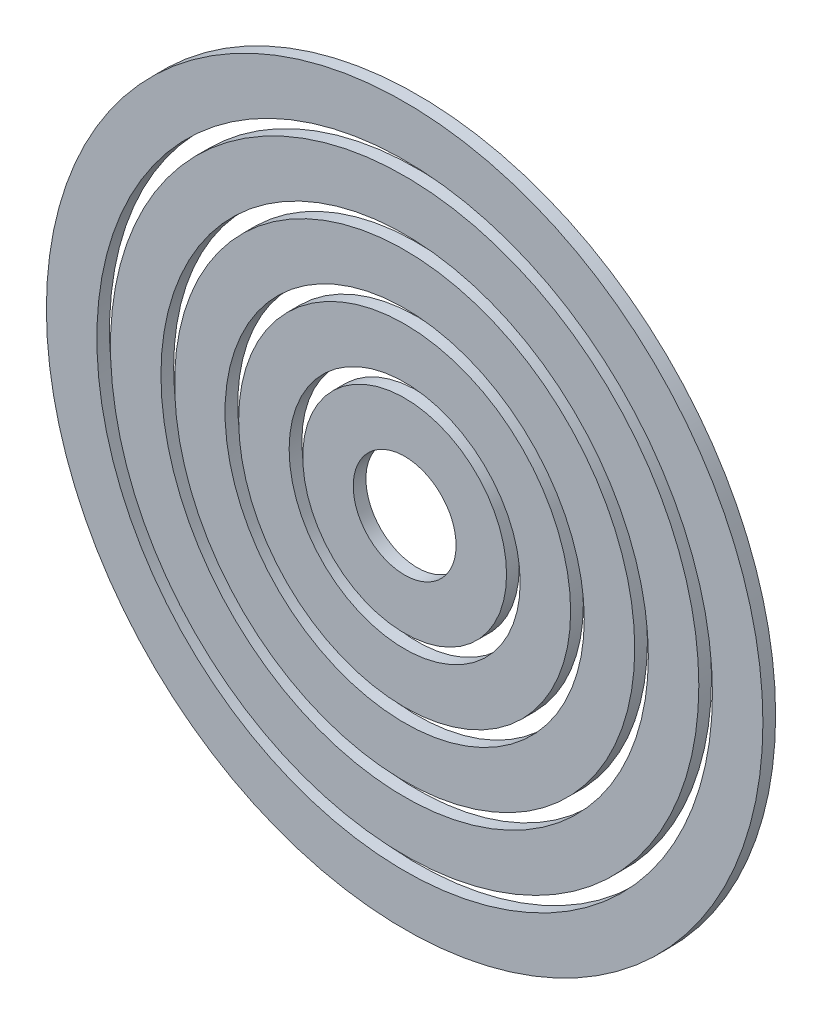
ISO-10303-21;
HEADER;
FILE_DESCRIPTION(('STEP AP214'),'2;1');
FILE_NAME('part.step','',(''),(''),'','','');
FILE_SCHEMA(('AUTOMOTIVE_DESIGN { 1 0 10303 214 1 1 1 1 }'));
ENDSEC;
DATA;
#1=APPLICATION_CONTEXT('core data for automotive mechanical design processes');
#2=APPLICATION_PROTOCOL_DEFINITION('international standard','automotive_design',2000,#1);
#3=PRODUCT_CONTEXT('',#1,'mechanical');
#4=PRODUCT('Part','Part','',(#3));
#5=PRODUCT_RELATED_PRODUCT_CATEGORY('part','',(#4));
#6=PRODUCT_DEFINITION_FORMATION('','',#4);
#7=PRODUCT_DEFINITION_CONTEXT('part definition',#1,'design');
#8=PRODUCT_DEFINITION('design','',#6,#7);
#9=PRODUCT_DEFINITION_SHAPE('','',#8);
#10=(LENGTH_UNIT() NAMED_UNIT(*) SI_UNIT(.MILLI.,.METRE.));
#11=(NAMED_UNIT(*) PLANE_ANGLE_UNIT() SI_UNIT($,.RADIAN.));
#12=(NAMED_UNIT(*) SI_UNIT($,.STERADIAN.) SOLID_ANGLE_UNIT());
#13=UNCERTAINTY_MEASURE_WITH_UNIT(LENGTH_MEASURE(1.E-05),#10,'distance_accuracy_value','');
#14=(GEOMETRIC_REPRESENTATION_CONTEXT(3) GLOBAL_UNCERTAINTY_ASSIGNED_CONTEXT((#13)) GLOBAL_UNIT_ASSIGNED_CONTEXT((#10,
#11,#12)) REPRESENTATION_CONTEXT('',''));
#15=CARTESIAN_POINT('',(0.,0.,0.));
#16=DIRECTION('',(0.,0.,1.));
#17=DIRECTION('',(1.,0.,0.));
#18=AXIS2_PLACEMENT_3D('',#15,#16,#17);
#19=CARTESIAN_POINT('',(0.,0.,1.9812));
#20=DIRECTION('',(0.,0.,-1.));
#21=DIRECTION('',(-1.,0.,0.));
#22=AXIS2_PLACEMENT_3D('',#19,#20,#21);
#23=CYLINDRICAL_SURFACE('',#22,8.026);
#24=CARTESIAN_POINT('',(0.,0.,1.9812));
#25=DIRECTION('',(0.,0.,1.));
#26=DIRECTION('',(1.,0.,0.));
#27=AXIS2_PLACEMENT_3D('',#24,#25,#26);
#28=CIRCLE('',#27,8.026);
#29=CARTESIAN_POINT('',(8.026,0.,1.9812));
#30=VERTEX_POINT('',#29);
#31=EDGE_CURVE('E110',#30,#30,#28,.T.);
#32=ORIENTED_EDGE('',*,*,#31,.T.);
#33=EDGE_LOOP('',(#32));
#34=FACE_BOUND('',#33,.T.);
#35=CARTESIAN_POINT('',(0.,0.,0.));
#36=DIRECTION('',(0.,0.,1.));
#37=DIRECTION('',(1.,0.,0.));
#38=AXIS2_PLACEMENT_3D('',#35,#36,#37);
#39=CIRCLE('',#38,8.026);
#40=CARTESIAN_POINT('',(8.026,0.,0.));
#41=VERTEX_POINT('',#40);
#42=EDGE_CURVE('E116',#41,#41,#39,.T.);
#43=ORIENTED_EDGE('',*,*,#42,.F.);
#44=EDGE_LOOP('',(#43));
#45=FACE_BOUND('',#44,.T.);
#46=ADVANCED_FACE('F103',(#34,#45),#23,.F.);
#47=CARTESIAN_POINT('',(0.,0.,1.9812));
#48=DIRECTION('',(0.,0.,-1.));
#49=DIRECTION('',(-1.,0.,0.));
#50=AXIS2_PLACEMENT_3D('',#47,#48,#49);
#51=CYLINDRICAL_SURFACE('',#50,15.9);
#52=CARTESIAN_POINT('',(0.,0.,1.9812));
#53=DIRECTION('',(0.,0.,1.));
#54=DIRECTION('',(1.,0.,0.));
#55=AXIS2_PLACEMENT_3D('',#52,#53,#54);
#56=CIRCLE('',#55,15.9);
#57=CARTESIAN_POINT('',(15.9,0.,1.9812));
#58=VERTEX_POINT('',#57);
#59=EDGE_CURVE('E12',#58,#58,#56,.T.);
#60=ORIENTED_EDGE('',*,*,#59,.F.);
#61=EDGE_LOOP('',(#60));
#62=FACE_BOUND('',#61,.T.);
#63=CARTESIAN_POINT('',(0.,0.,0.));
#64=DIRECTION('',(0.,0.,1.));
#65=DIRECTION('',(1.,0.,0.));
#66=AXIS2_PLACEMENT_3D('',#63,#64,#65);
#67=CIRCLE('',#66,15.9);
#68=CARTESIAN_POINT('',(15.9,0.,0.));
#69=VERTEX_POINT('',#68);
#70=EDGE_CURVE('E106',#69,#69,#67,.T.);
#71=ORIENTED_EDGE('',*,*,#70,.T.);
#72=EDGE_LOOP('',(#71));
#73=FACE_BOUND('',#72,.T.);
#74=ADVANCED_FACE('F123',(#62,#73),#51,.T.);
#75=CARTESIAN_POINT('',(0.,0.,1.9812));
#76=DIRECTION('',(0.,0.,1.));
#77=DIRECTION('',(1.,0.,0.));
#78=AXIS2_PLACEMENT_3D('',#75,#76,#77);
#79=PLANE('',#78);
#80=ORIENTED_EDGE('',*,*,#31,.F.);
#81=EDGE_LOOP('',(#80));
#82=FACE_BOUND('',#81,.T.);
#83=ORIENTED_EDGE('',*,*,#59,.T.);
#84=EDGE_LOOP('',(#83));
#85=FACE_BOUND('',#84,.T.);
#86=ADVANCED_FACE('F127',(#82,#85),#79,.T.);
#87=CARTESIAN_POINT('',(0.,0.,0.));
#88=DIRECTION('',(0.,0.,1.));
#89=DIRECTION('',(1.,0.,0.));
#90=AXIS2_PLACEMENT_3D('',#87,#88,#89);
#91=PLANE('',#90);
#92=ORIENTED_EDGE('',*,*,#42,.T.);
#93=EDGE_LOOP('',(#92));
#94=FACE_BOUND('',#93,.T.);
#95=ORIENTED_EDGE('',*,*,#70,.F.);
#96=EDGE_LOOP('',(#95));
#97=FACE_BOUND('',#96,.T.);
#98=ADVANCED_FACE('F125',(#94,#97),#91,.F.);
#99=CLOSED_SHELL('',(#46,#74,#86,#98));
#100=MANIFOLD_SOLID_BREP('B2',#99);
#101=CARTESIAN_POINT('',(0.,0.,1.9812));
#102=DIRECTION('',(0.,0.,-1.));
#103=DIRECTION('',(-1.,0.,0.));
#104=AXIS2_PLACEMENT_3D('',#101,#102,#103);
#105=CYLINDRICAL_SURFACE('',#104,18.026);
#106=CARTESIAN_POINT('',(0.,0.,1.9812));
#107=DIRECTION('',(0.,0.,1.));
#108=DIRECTION('',(1.,0.,0.));
#109=AXIS2_PLACEMENT_3D('',#106,#107,#108);
#110=CIRCLE('',#109,18.026);
#111=CARTESIAN_POINT('',(18.026,0.,1.9812));
#112=VERTEX_POINT('',#111);
#113=EDGE_CURVE('E179',#112,#112,#110,.T.);
#114=ORIENTED_EDGE('',*,*,#113,.T.);
#115=EDGE_LOOP('',(#114));
#116=FACE_BOUND('',#115,.T.);
#117=CARTESIAN_POINT('',(0.,0.,0.));
#118=DIRECTION('',(0.,0.,1.));
#119=DIRECTION('',(1.,0.,0.));
#120=AXIS2_PLACEMENT_3D('',#117,#118,#119);
#121=CIRCLE('',#120,18.026);
#122=CARTESIAN_POINT('',(18.026,0.,0.));
#123=VERTEX_POINT('',#122);
#124=EDGE_CURVE('E185',#123,#123,#121,.T.);
#125=ORIENTED_EDGE('',*,*,#124,.F.);
#126=EDGE_LOOP('',(#125));
#127=FACE_BOUND('',#126,.T.);
#128=ADVANCED_FACE('F172',(#116,#127),#105,.F.);
#129=CARTESIAN_POINT('',(0.,0.,1.9812));
#130=DIRECTION('',(0.,0.,-1.));
#131=DIRECTION('',(-1.,0.,0.));
#132=AXIS2_PLACEMENT_3D('',#129,#130,#131);
#133=CYLINDRICAL_SURFACE('',#132,25.9);
#134=CARTESIAN_POINT('',(0.,0.,1.9812));
#135=DIRECTION('',(0.,0.,1.));
#136=DIRECTION('',(1.,0.,0.));
#137=AXIS2_PLACEMENT_3D('',#134,#135,#136);
#138=CIRCLE('',#137,25.9);
#139=CARTESIAN_POINT('',(25.9,0.,1.9812));
#140=VERTEX_POINT('',#139);
#141=EDGE_CURVE('E102',#140,#140,#138,.T.);
#142=ORIENTED_EDGE('',*,*,#141,.F.);
#143=EDGE_LOOP('',(#142));
#144=FACE_BOUND('',#143,.T.);
#145=CARTESIAN_POINT('',(0.,0.,0.));
#146=DIRECTION('',(0.,0.,1.));
#147=DIRECTION('',(1.,0.,0.));
#148=AXIS2_PLACEMENT_3D('',#145,#146,#147);
#149=CIRCLE('',#148,25.9);
#150=CARTESIAN_POINT('',(25.9,0.,0.));
#151=VERTEX_POINT('',#150);
#152=EDGE_CURVE('E175',#151,#151,#149,.T.);
#153=ORIENTED_EDGE('',*,*,#152,.T.);
#154=EDGE_LOOP('',(#153));
#155=FACE_BOUND('',#154,.T.);
#156=ADVANCED_FACE('F192',(#144,#155),#133,.T.);
#157=CARTESIAN_POINT('',(0.,0.,1.9812));
#158=DIRECTION('',(0.,0.,1.));
#159=DIRECTION('',(1.,0.,0.));
#160=AXIS2_PLACEMENT_3D('',#157,#158,#159);
#161=PLANE('',#160);
#162=ORIENTED_EDGE('',*,*,#113,.F.);
#163=EDGE_LOOP('',(#162));
#164=FACE_BOUND('',#163,.T.);
#165=ORIENTED_EDGE('',*,*,#141,.T.);
#166=EDGE_LOOP('',(#165));
#167=FACE_BOUND('',#166,.T.);
#168=ADVANCED_FACE('F196',(#164,#167),#161,.T.);
#169=CARTESIAN_POINT('',(0.,0.,0.));
#170=DIRECTION('',(0.,0.,1.));
#171=DIRECTION('',(1.,0.,0.));
#172=AXIS2_PLACEMENT_3D('',#169,#170,#171);
#173=PLANE('',#172);
#174=ORIENTED_EDGE('',*,*,#124,.T.);
#175=EDGE_LOOP('',(#174));
#176=FACE_BOUND('',#175,.T.);
#177=ORIENTED_EDGE('',*,*,#152,.F.);
#178=EDGE_LOOP('',(#177));
#179=FACE_BOUND('',#178,.T.);
#180=ADVANCED_FACE('F194',(#176,#179),#173,.F.);
#181=CLOSED_SHELL('',(#128,#156,#168,#180));
#182=MANIFOLD_SOLID_BREP('B7',#181);
#183=CARTESIAN_POINT('',(0.,0.,1.9812));
#184=DIRECTION('',(0.,0.,-1.));
#185=DIRECTION('',(-1.,0.,0.));
#186=AXIS2_PLACEMENT_3D('',#183,#184,#185);
#187=CYLINDRICAL_SURFACE('',#186,28.026);
#188=CARTESIAN_POINT('',(0.,0.,1.9812));
#189=DIRECTION('',(0.,0.,1.));
#190=DIRECTION('',(1.,0.,0.));
#191=AXIS2_PLACEMENT_3D('',#188,#189,#190);
#192=CIRCLE('',#191,28.026);
#193=CARTESIAN_POINT('',(28.026,0.,1.9812));
#194=VERTEX_POINT('',#193);
#195=EDGE_CURVE('E248',#194,#194,#192,.T.);
#196=ORIENTED_EDGE('',*,*,#195,.T.);
#197=EDGE_LOOP('',(#196));
#198=FACE_BOUND('',#197,.T.);
#199=CARTESIAN_POINT('',(0.,0.,0.));
#200=DIRECTION('',(0.,0.,1.));
#201=DIRECTION('',(1.,0.,0.));
#202=AXIS2_PLACEMENT_3D('',#199,#200,#201);
#203=CIRCLE('',#202,28.026);
#204=CARTESIAN_POINT('',(28.026,0.,0.));
#205=VERTEX_POINT('',#204);
#206=EDGE_CURVE('E254',#205,#205,#203,.T.);
#207=ORIENTED_EDGE('',*,*,#206,.F.);
#208=EDGE_LOOP('',(#207));
#209=FACE_BOUND('',#208,.T.);
#210=ADVANCED_FACE('F241',(#198,#209),#187,.F.);
#211=CARTESIAN_POINT('',(0.,0.,1.9812));
#212=DIRECTION('',(0.,0.,-1.));
#213=DIRECTION('',(-1.,0.,0.));
#214=AXIS2_PLACEMENT_3D('',#211,#212,#213);
#215=CYLINDRICAL_SURFACE('',#214,35.9);
#216=CARTESIAN_POINT('',(0.,0.,1.9812));
#217=DIRECTION('',(0.,0.,1.));
#218=DIRECTION('',(1.,0.,0.));
#219=AXIS2_PLACEMENT_3D('',#216,#217,#218);
#220=CIRCLE('',#219,35.9);
#221=CARTESIAN_POINT('',(35.9,0.,1.9812));
#222=VERTEX_POINT('',#221);
#223=EDGE_CURVE('E171',#222,#222,#220,.T.);
#224=ORIENTED_EDGE('',*,*,#223,.F.);
#225=EDGE_LOOP('',(#224));
#226=FACE_BOUND('',#225,.T.);
#227=CARTESIAN_POINT('',(0.,0.,0.));
#228=DIRECTION('',(0.,0.,1.));
#229=DIRECTION('',(1.,0.,0.));
#230=AXIS2_PLACEMENT_3D('',#227,#228,#229);
#231=CIRCLE('',#230,35.9);
#232=CARTESIAN_POINT('',(35.9,0.,0.));
#233=VERTEX_POINT('',#232);
#234=EDGE_CURVE('E244',#233,#233,#231,.T.);
#235=ORIENTED_EDGE('',*,*,#234,.T.);
#236=EDGE_LOOP('',(#235));
#237=FACE_BOUND('',#236,.T.);
#238=ADVANCED_FACE('F261',(#226,#237),#215,.T.);
#239=CARTESIAN_POINT('',(0.,0.,1.9812));
#240=DIRECTION('',(0.,0.,1.));
#241=DIRECTION('',(1.,0.,0.));
#242=AXIS2_PLACEMENT_3D('',#239,#240,#241);
#243=PLANE('',#242);
#244=ORIENTED_EDGE('',*,*,#195,.F.);
#245=EDGE_LOOP('',(#244));
#246=FACE_BOUND('',#245,.T.);
#247=ORIENTED_EDGE('',*,*,#223,.T.);
#248=EDGE_LOOP('',(#247));
#249=FACE_BOUND('',#248,.T.);
#250=ADVANCED_FACE('F265',(#246,#249),#243,.T.);
#251=CARTESIAN_POINT('',(0.,0.,0.));
#252=DIRECTION('',(0.,0.,1.));
#253=DIRECTION('',(1.,0.,0.));
#254=AXIS2_PLACEMENT_3D('',#251,#252,#253);
#255=PLANE('',#254);
#256=ORIENTED_EDGE('',*,*,#206,.T.);
#257=EDGE_LOOP('',(#256));
#258=FACE_BOUND('',#257,.T.);
#259=ORIENTED_EDGE('',*,*,#234,.F.);
#260=EDGE_LOOP('',(#259));
#261=FACE_BOUND('',#260,.T.);
#262=ADVANCED_FACE('F263',(#258,#261),#255,.F.);
#263=CLOSED_SHELL('',(#210,#238,#250,#262));
#264=MANIFOLD_SOLID_BREP('B97',#263);
#265=CARTESIAN_POINT('',(0.,0.,1.9812));
#266=DIRECTION('',(0.,0.,-1.));
#267=DIRECTION('',(-1.,0.,0.));
#268=AXIS2_PLACEMENT_3D('',#265,#266,#267);
#269=CYLINDRICAL_SURFACE('',#268,38.026);
#270=CARTESIAN_POINT('',(0.,0.,1.9812));
#271=DIRECTION('',(0.,0.,1.));
#272=DIRECTION('',(1.,0.,0.));
#273=AXIS2_PLACEMENT_3D('',#270,#271,#272);
#274=CIRCLE('',#273,38.026);
#275=CARTESIAN_POINT('',(38.026,0.,1.9812));
#276=VERTEX_POINT('',#275);
#277=EDGE_CURVE('E316',#276,#276,#274,.T.);
#278=ORIENTED_EDGE('',*,*,#277,.T.);
#279=EDGE_LOOP('',(#278));
#280=FACE_BOUND('',#279,.T.);
#281=CARTESIAN_POINT('',(0.,0.,0.));
#282=DIRECTION('',(0.,0.,1.));
#283=DIRECTION('',(1.,0.,0.));
#284=AXIS2_PLACEMENT_3D('',#281,#282,#283);
#285=CIRCLE('',#284,38.026);
#286=CARTESIAN_POINT('',(38.026,0.,0.));
#287=VERTEX_POINT('',#286);
#288=EDGE_CURVE('E322',#287,#287,#285,.T.);
#289=ORIENTED_EDGE('',*,*,#288,.F.);
#290=EDGE_LOOP('',(#289));
#291=FACE_BOUND('',#290,.T.);
#292=ADVANCED_FACE('F309',(#280,#291),#269,.F.);
#293=CARTESIAN_POINT('',(0.,0.,1.9812));
#294=DIRECTION('',(0.,0.,-1.));
#295=DIRECTION('',(-1.,0.,0.));
#296=AXIS2_PLACEMENT_3D('',#293,#294,#295);
#297=CYLINDRICAL_SURFACE('',#296,45.9);
#298=CARTESIAN_POINT('',(0.,0.,1.9812));
#299=DIRECTION('',(0.,0.,1.));
#300=DIRECTION('',(1.,0.,0.));
#301=AXIS2_PLACEMENT_3D('',#298,#299,#300);
#302=CIRCLE('',#301,45.9);
#303=CARTESIAN_POINT('',(45.9,0.,1.9812));
#304=VERTEX_POINT('',#303);
#305=EDGE_CURVE('E240',#304,#304,#302,.T.);
#306=ORIENTED_EDGE('',*,*,#305,.F.);
#307=EDGE_LOOP('',(#306));
#308=FACE_BOUND('',#307,.T.);
#309=CARTESIAN_POINT('',(0.,0.,0.));
#310=DIRECTION('',(0.,0.,1.));
#311=DIRECTION('',(1.,0.,0.));
#312=AXIS2_PLACEMENT_3D('',#309,#310,#311);
#313=CIRCLE('',#312,45.9);
#314=CARTESIAN_POINT('',(45.9,0.,0.));
#315=VERTEX_POINT('',#314);
#316=EDGE_CURVE('E312',#315,#315,#313,.T.);
#317=ORIENTED_EDGE('',*,*,#316,.T.);
#318=EDGE_LOOP('',(#317));
#319=FACE_BOUND('',#318,.T.);
#320=ADVANCED_FACE('F329',(#308,#319),#297,.T.);
#321=CARTESIAN_POINT('',(0.,0.,1.9812));
#322=DIRECTION('',(0.,0.,1.));
#323=DIRECTION('',(1.,0.,0.));
#324=AXIS2_PLACEMENT_3D('',#321,#322,#323);
#325=PLANE('',#324);
#326=ORIENTED_EDGE('',*,*,#277,.F.);
#327=EDGE_LOOP('',(#326));
#328=FACE_BOUND('',#327,.T.);
#329=ORIENTED_EDGE('',*,*,#305,.T.);
#330=EDGE_LOOP('',(#329));
#331=FACE_BOUND('',#330,.T.);
#332=ADVANCED_FACE('F333',(#328,#331),#325,.T.);
#333=CARTESIAN_POINT('',(0.,0.,0.));
#334=DIRECTION('',(0.,0.,1.));
#335=DIRECTION('',(1.,0.,0.));
#336=AXIS2_PLACEMENT_3D('',#333,#334,#335);
#337=PLANE('',#336);
#338=ORIENTED_EDGE('',*,*,#288,.T.);
#339=EDGE_LOOP('',(#338));
#340=FACE_BOUND('',#339,.T.);
#341=ORIENTED_EDGE('',*,*,#316,.F.);
#342=EDGE_LOOP('',(#341));
#343=FACE_BOUND('',#342,.T.);
#344=ADVANCED_FACE('F331',(#340,#343),#337,.F.);
#345=CLOSED_SHELL('',(#292,#320,#332,#344));
#346=MANIFOLD_SOLID_BREP('B166',#345);
#347=CARTESIAN_POINT('',(0.,0.,1.9812));
#348=DIRECTION('',(0.,0.,-1.));
#349=DIRECTION('',(-1.,0.,0.));
#350=AXIS2_PLACEMENT_3D('',#347,#348,#349);
#351=CYLINDRICAL_SURFACE('',#350,48.026);
#352=CARTESIAN_POINT('',(0.,0.,1.9812));
#353=DIRECTION('',(0.,0.,1.));
#354=DIRECTION('',(1.,0.,0.));
#355=AXIS2_PLACEMENT_3D('',#352,#353,#354);
#356=CIRCLE('',#355,48.026);
#357=CARTESIAN_POINT('',(48.026,0.,1.9812));
#358=VERTEX_POINT('',#357);
#359=EDGE_CURVE('E377',#358,#358,#356,.T.);
#360=ORIENTED_EDGE('',*,*,#359,.T.);
#361=EDGE_LOOP('',(#360));
#362=FACE_BOUND('',#361,.T.);
#363=CARTESIAN_POINT('',(0.,0.,0.));
#364=DIRECTION('',(0.,0.,1.));
#365=DIRECTION('',(1.,0.,0.));
#366=AXIS2_PLACEMENT_3D('',#363,#364,#365);
#367=CIRCLE('',#366,48.026);
#368=CARTESIAN_POINT('',(48.026,0.,0.));
#369=VERTEX_POINT('',#368);
#370=EDGE_CURVE('E383',#369,#369,#367,.T.);
#371=ORIENTED_EDGE('',*,*,#370,.F.);
#372=EDGE_LOOP('',(#371));
#373=FACE_BOUND('',#372,.T.);
#374=ADVANCED_FACE('F370',(#362,#373),#351,.F.);
#375=CARTESIAN_POINT('',(0.,0.,1.9812));
#376=DIRECTION('',(0.,0.,-1.));
#377=DIRECTION('',(-1.,0.,0.));
#378=AXIS2_PLACEMENT_3D('',#375,#376,#377);
#379=CYLINDRICAL_SURFACE('',#378,55.9);
#380=CARTESIAN_POINT('',(0.,0.,1.9812));
#381=DIRECTION('',(0.,0.,1.));
#382=DIRECTION('',(1.,0.,0.));
#383=AXIS2_PLACEMENT_3D('',#380,#381,#382);
#384=CIRCLE('',#383,55.9);
#385=CARTESIAN_POINT('',(55.9,0.,1.9812));
#386=VERTEX_POINT('',#385);
#387=EDGE_CURVE('E308',#386,#386,#384,.T.);
#388=ORIENTED_EDGE('',*,*,#387,.F.);
#389=EDGE_LOOP('',(#388));
#390=FACE_BOUND('',#389,.T.);
#391=CARTESIAN_POINT('',(0.,0.,0.));
#392=DIRECTION('',(0.,0.,1.));
#393=DIRECTION('',(1.,0.,0.));
#394=AXIS2_PLACEMENT_3D('',#391,#392,#393);
#395=CIRCLE('',#394,55.9);
#396=CARTESIAN_POINT('',(55.9,0.,0.));
#397=VERTEX_POINT('',#396);
#398=EDGE_CURVE('E373',#397,#397,#395,.T.);
#399=ORIENTED_EDGE('',*,*,#398,.T.);
#400=EDGE_LOOP('',(#399));
#401=FACE_BOUND('',#400,.T.);
#402=ADVANCED_FACE('F390',(#390,#401),#379,.T.);
#403=CARTESIAN_POINT('',(0.,0.,1.9812));
#404=DIRECTION('',(0.,0.,1.));
#405=DIRECTION('',(1.,0.,0.));
#406=AXIS2_PLACEMENT_3D('',#403,#404,#405);
#407=PLANE('',#406);
#408=ORIENTED_EDGE('',*,*,#359,.F.);
#409=EDGE_LOOP('',(#408));
#410=FACE_BOUND('',#409,.T.);
#411=ORIENTED_EDGE('',*,*,#387,.T.);
#412=EDGE_LOOP('',(#411));
#413=FACE_BOUND('',#412,.T.);
#414=ADVANCED_FACE('F394',(#410,#413),#407,.T.);
#415=CARTESIAN_POINT('',(0.,0.,0.));
#416=DIRECTION('',(0.,0.,1.));
#417=DIRECTION('',(1.,0.,0.));
#418=AXIS2_PLACEMENT_3D('',#415,#416,#417);
#419=PLANE('',#418);
#420=ORIENTED_EDGE('',*,*,#370,.T.);
#421=EDGE_LOOP('',(#420));
#422=FACE_BOUND('',#421,.T.);
#423=ORIENTED_EDGE('',*,*,#398,.F.);
#424=EDGE_LOOP('',(#423));
#425=FACE_BOUND('',#424,.T.);
#426=ADVANCED_FACE('F392',(#422,#425),#419,.F.);
#427=CLOSED_SHELL('',(#374,#402,#414,#426));
#428=MANIFOLD_SOLID_BREP('B235',#427);
#429=ADVANCED_BREP_SHAPE_REPRESENTATION('',(#18,#100,#182,#264,#346,#428),#14);
#430=SHAPE_DEFINITION_REPRESENTATION(#9,#429);
ENDSEC;
END-ISO-10303-21;
